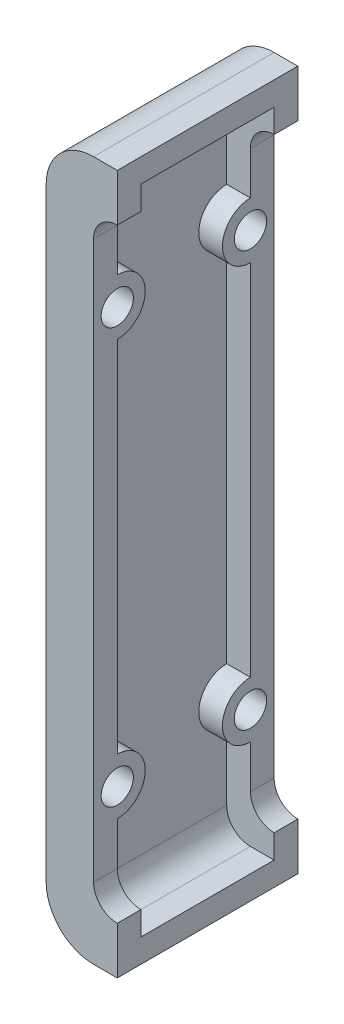
ISO-10303-21;
HEADER;
FILE_DESCRIPTION(('STEP AP214'),'2;1');
FILE_NAME('part.step','',(''),(''),'','','');
FILE_SCHEMA(('AUTOMOTIVE_DESIGN { 1 0 10303 214 1 1 1 1 }'));
ENDSEC;
DATA;
#1=APPLICATION_CONTEXT('core data for automotive mechanical design processes');
#2=APPLICATION_PROTOCOL_DEFINITION('international standard','automotive_design',2000,#1);
#3=PRODUCT_CONTEXT('',#1,'mechanical');
#4=PRODUCT('Part','Part','',(#3));
#5=PRODUCT_RELATED_PRODUCT_CATEGORY('part','',(#4));
#6=PRODUCT_DEFINITION_FORMATION('','',#4);
#7=PRODUCT_DEFINITION_CONTEXT('part definition',#1,'design');
#8=PRODUCT_DEFINITION('design','',#6,#7);
#9=PRODUCT_DEFINITION_SHAPE('','',#8);
#10=(LENGTH_UNIT() NAMED_UNIT(*) SI_UNIT(.MILLI.,.METRE.));
#11=(NAMED_UNIT(*) PLANE_ANGLE_UNIT() SI_UNIT($,.RADIAN.));
#12=(NAMED_UNIT(*) SI_UNIT($,.STERADIAN.) SOLID_ANGLE_UNIT());
#13=UNCERTAINTY_MEASURE_WITH_UNIT(LENGTH_MEASURE(1.E-05),#10,'distance_accuracy_value','');
#14=(GEOMETRIC_REPRESENTATION_CONTEXT(3) GLOBAL_UNCERTAINTY_ASSIGNED_CONTEXT((#13)) GLOBAL_UNIT_ASSIGNED_CONTEXT((#10,
#11,#12)) REPRESENTATION_CONTEXT('',''));
#15=CARTESIAN_POINT('',(0.,0.,0.));
#16=DIRECTION('',(0.,0.,1.));
#17=DIRECTION('',(1.,0.,0.));
#18=AXIS2_PLACEMENT_3D('',#15,#16,#17);
#19=CARTESIAN_POINT('',(-5.,-68.8,-14.05));
#20=DIRECTION('',(0.,0.,-1.));
#21=DIRECTION('',(-1.,0.,0.));
#22=AXIS2_PLACEMENT_3D('',#19,#20,#21);
#23=PLANE('',#22);
#24=DIRECTION('',(-1.,0.,0.));
#25=VECTOR('',#24,1.);
#26=CARTESIAN_POINT('',(13.1928010672488,37.9,-14.05));
#27=LINE('',#26,#25);
#28=CARTESIAN_POINT('',(0.,37.9,-14.05));
#29=VERTEX_POINT('',#28);
#30=CARTESIAN_POINT('',(-5.,37.9,-14.05));
#31=VERTEX_POINT('',#30);
#32=EDGE_CURVE('E581',#29,#31,#27,.T.);
#33=ORIENTED_EDGE('',*,*,#32,.T.);
#34=DIRECTION('',(0.,1.,0.));
#35=VECTOR('',#34,1.);
#36=CARTESIAN_POINT('',(-5.,-68.8,-14.05));
#37=LINE('',#36,#35);
#38=CARTESIAN_POINT('',(-5.,-37.9,-14.05));
#39=VERTEX_POINT('',#38);
#40=EDGE_CURVE('E267',#39,#31,#37,.T.);
#41=ORIENTED_EDGE('',*,*,#40,.F.);
#42=DIRECTION('',(-1.,0.,0.));
#43=VECTOR('',#42,1.);
#44=CARTESIAN_POINT('',(13.1928010672488,-37.9,-14.05));
#45=LINE('',#44,#43);
#46=CARTESIAN_POINT('',(0.,-37.9,-14.05));
#47=VERTEX_POINT('',#46);
#48=EDGE_CURVE('E470',#47,#39,#45,.T.);
#49=ORIENTED_EDGE('',*,*,#48,.F.);
#50=DIRECTION('',(0.,-1.,0.));
#51=VECTOR('',#50,1.);
#52=CARTESIAN_POINT('',(0.,63.8,-14.05));
#53=LINE('',#52,#51);
#54=EDGE_CURVE('E329',#29,#47,#53,.T.);
#55=ORIENTED_EDGE('',*,*,#54,.F.);
#56=EDGE_LOOP('',(#33,#41,#49,#55));
#57=FACE_BOUND('',#56,.T.);
#58=ADVANCED_FACE('F37',(#57),#23,.F.);
#59=CARTESIAN_POINT('',(-5.,0.,0.));
#60=DIRECTION('',(-1.,0.,0.));
#61=DIRECTION('',(0.,0.,1.));
#62=AXIS2_PLACEMENT_3D('',#59,#60,#61);
#63=PLANE('',#62);
#64=DIRECTION('',(0.,-1.,0.));
#65=VECTOR('',#64,1.);
#66=CARTESIAN_POINT('',(-5.,-68.8,14.05));
#67=LINE('',#66,#65);
#68=CARTESIAN_POINT('',(-5.,63.7999999999999,14.05));
#69=VERTEX_POINT('',#68);
#70=CARTESIAN_POINT('',(-5.,49.7,14.05));
#71=VERTEX_POINT('',#70);
#72=EDGE_CURVE('E235',#69,#71,#67,.T.);
#73=ORIENTED_EDGE('',*,*,#72,.T.);
#74=CARTESIAN_POINT('',(-5.,43.8,14.05));
#75=DIRECTION('',(-1.,0.,0.));
#76=DIRECTION('',(0.,0.,1.));
#77=AXIS2_PLACEMENT_3D('',#74,#75,#76);
#78=CIRCLE('',#77,5.9);
#79=CARTESIAN_POINT('',(-5.,37.9,14.05));
#80=VERTEX_POINT('',#79);
#81=EDGE_CURVE('E59',#71,#80,#78,.T.);
#82=ORIENTED_EDGE('',*,*,#81,.T.);
#83=CARTESIAN_POINT('',(-5.,-37.9,14.05));
#84=VERTEX_POINT('',#83);
#85=EDGE_CURVE('E269',#80,#84,#67,.T.);
#86=ORIENTED_EDGE('',*,*,#85,.T.);
#87=CARTESIAN_POINT('',(-5.,-43.8,14.05));
#88=DIRECTION('',(1.,0.,0.));
#89=DIRECTION('',(0.,0.,-1.));
#90=AXIS2_PLACEMENT_3D('',#87,#88,#89);
#91=CIRCLE('',#90,5.89999999999999);
#92=CARTESIAN_POINT('',(-5.,-49.7,14.05));
#93=VERTEX_POINT('',#92);
#94=EDGE_CURVE('E479',#84,#93,#91,.F.);
#95=ORIENTED_EDGE('',*,*,#94,.T.);
#96=CARTESIAN_POINT('',(-5.,-63.8,14.05));
#97=VERTEX_POINT('',#96);
#98=EDGE_CURVE('E266',#93,#97,#67,.T.);
#99=ORIENTED_EDGE('',*,*,#98,.T.);
#100=DIRECTION('',(0.,0.,-1.));
#101=VECTOR('',#100,1.);
#102=CARTESIAN_POINT('',(-5.,-63.8,-14.05));
#103=LINE('',#102,#101);
#104=CARTESIAN_POINT('',(-5.,-63.8,-14.05));
#105=VERTEX_POINT('',#104);
#106=EDGE_CURVE('E332',#97,#105,#103,.T.);
#107=ORIENTED_EDGE('',*,*,#106,.T.);
#108=CARTESIAN_POINT('',(-5.,-49.7,-14.05));
#109=VERTEX_POINT('',#108);
#110=EDGE_CURVE('E263',#105,#109,#37,.T.);
#111=ORIENTED_EDGE('',*,*,#110,.T.);
#112=CARTESIAN_POINT('',(-5.,-43.8,-14.05));
#113=DIRECTION('',(1.,0.,0.));
#114=DIRECTION('',(0.,0.,-1.));
#115=AXIS2_PLACEMENT_3D('',#112,#113,#114);
#116=CIRCLE('',#115,5.89999999999999);
#117=EDGE_CURVE('E471',#39,#109,#116,.T.);
#118=ORIENTED_EDGE('',*,*,#117,.F.);
#119=ORIENTED_EDGE('',*,*,#40,.T.);
#120=CARTESIAN_POINT('',(-5.,43.8,-14.05));
#121=DIRECTION('',(1.,0.,0.));
#122=DIRECTION('',(0.,0.,-1.));
#123=AXIS2_PLACEMENT_3D('',#120,#121,#122);
#124=CIRCLE('',#123,5.9);
#125=CARTESIAN_POINT('',(-5.,49.7,-14.05));
#126=VERTEX_POINT('',#125);
#127=EDGE_CURVE('E578',#126,#31,#124,.T.);
#128=ORIENTED_EDGE('',*,*,#127,.F.);
#129=CARTESIAN_POINT('',(-5.,63.7999999999999,-14.05));
#130=VERTEX_POINT('',#129);
#131=EDGE_CURVE('E262',#126,#130,#37,.T.);
#132=ORIENTED_EDGE('',*,*,#131,.T.);
#133=DIRECTION('',(0.,0.,1.));
#134=VECTOR('',#133,1.);
#135=CARTESIAN_POINT('',(-5.,63.8,14.05));
#136=LINE('',#135,#134);
#137=EDGE_CURVE('E328',#130,#69,#136,.T.);
#138=ORIENTED_EDGE('',*,*,#137,.T.);
#139=EDGE_LOOP('',(#73,#82,#86,#95,#99,#107,#111,#118,#119,#128,#132,#138));
#140=FACE_BOUND('',#139,.T.);
#141=ADVANCED_FACE('F443',(#140),#63,.F.);
#142=DIRECTION('',(-1.,0.,0.));
#143=VECTOR('',#142,1.);
#144=CARTESIAN_POINT('',(13.1928010672488,49.7,-14.05));
#145=LINE('',#144,#143);
#146=CARTESIAN_POINT('',(0.,49.7,-14.05));
#147=VERTEX_POINT('',#146);
#148=EDGE_CURVE('E587',#147,#126,#145,.T.);
#149=ORIENTED_EDGE('',*,*,#148,.F.);
#150=CARTESIAN_POINT('',(0.,58.8,-14.05));
#151=VERTEX_POINT('',#150);
#152=EDGE_CURVE('E325',#151,#147,#53,.T.);
#153=ORIENTED_EDGE('',*,*,#152,.F.);
#154=CARTESIAN_POINT('',(5.00000000000001,58.8,-14.05));
#155=DIRECTION('',(0.,0.,-1.));
#156=DIRECTION('',(-1.,0.,0.));
#157=AXIS2_PLACEMENT_3D('',#154,#155,#156);
#158=CIRCLE('',#157,5.);
#159=CARTESIAN_POINT('',(5.00000000000002,63.7999999999999,-14.05));
#160=VERTEX_POINT('',#159);
#161=EDGE_CURVE('E242',#151,#160,#158,.T.);
#162=ORIENTED_EDGE('',*,*,#161,.T.);
#163=DIRECTION('',(0.,1.,0.));
#164=VECTOR('',#163,1.);
#165=CARTESIAN_POINT('',(5.00000000000002,-68.8,-14.05));
#166=LINE('',#165,#164);
#167=CARTESIAN_POINT('',(5.00000000000002,68.8,-14.05));
#168=VERTEX_POINT('',#167);
#169=EDGE_CURVE('E238',#160,#168,#166,.T.);
#170=ORIENTED_EDGE('',*,*,#169,.T.);
#171=DIRECTION('',(1.,0.,0.));
#172=VECTOR('',#171,1.);
#173=CARTESIAN_POINT('',(-5.,68.8,-14.05));
#174=LINE('',#173,#172);
#175=CARTESIAN_POINT('',(0.,68.8,-14.05));
#176=VERTEX_POINT('',#175);
#177=EDGE_CURVE('E222',#176,#168,#174,.T.);
#178=ORIENTED_EDGE('',*,*,#177,.F.);
#179=CARTESIAN_POINT('',(0.,63.8,-14.05));
#180=DIRECTION('',(0.,0.,-1.));
#181=DIRECTION('',(-1.,0.,0.));
#182=AXIS2_PLACEMENT_3D('',#179,#180,#181);
#183=CIRCLE('',#182,5.);
#184=EDGE_CURVE('E335',#176,#130,#183,.F.);
#185=ORIENTED_EDGE('',*,*,#184,.T.);
#186=ORIENTED_EDGE('',*,*,#131,.F.);
#187=EDGE_LOOP('',(#149,#153,#162,#170,#178,#185,#186));
#188=FACE_BOUND('',#187,.T.);
#189=ADVANCED_FACE('F239',(#188),#23,.F.);
#190=DIRECTION('',(-1.,0.,0.));
#191=VECTOR('',#190,1.);
#192=CARTESIAN_POINT('',(13.1928010672488,-49.7,-14.05));
#193=LINE('',#192,#191);
#194=CARTESIAN_POINT('',(0.,-49.7,-14.05));
#195=VERTEX_POINT('',#194);
#196=EDGE_CURVE('E465',#195,#109,#193,.T.);
#197=ORIENTED_EDGE('',*,*,#196,.T.);
#198=ORIENTED_EDGE('',*,*,#110,.F.);
#199=CARTESIAN_POINT('',(0.,-63.8,-14.05));
#200=DIRECTION('',(0.,0.,-1.));
#201=DIRECTION('',(-1.,0.,0.));
#202=AXIS2_PLACEMENT_3D('',#199,#200,#201);
#203=CIRCLE('',#202,5.);
#204=CARTESIAN_POINT('',(0.,-68.8,-14.05));
#205=VERTEX_POINT('',#204);
#206=EDGE_CURVE('E337',#105,#205,#203,.F.);
#207=ORIENTED_EDGE('',*,*,#206,.T.);
#208=DIRECTION('',(1.,0.,0.));
#209=VECTOR('',#208,1.);
#210=CARTESIAN_POINT('',(-5.,-68.8,-14.05));
#211=LINE('',#210,#209);
#212=CARTESIAN_POINT('',(5.00000000000002,-68.8,-14.05));
#213=VERTEX_POINT('',#212);
#214=EDGE_CURVE('E270',#205,#213,#211,.T.);
#215=ORIENTED_EDGE('',*,*,#214,.T.);
#216=CARTESIAN_POINT('',(5.00000000000002,-63.8,-14.05));
#217=VERTEX_POINT('',#216);
#218=EDGE_CURVE('E246',#213,#217,#166,.T.);
#219=ORIENTED_EDGE('',*,*,#218,.T.);
#220=CARTESIAN_POINT('',(5.00000000000002,-58.8,-14.05));
#221=DIRECTION('',(0.,0.,-1.));
#222=DIRECTION('',(-1.,0.,0.));
#223=AXIS2_PLACEMENT_3D('',#220,#221,#222);
#224=CIRCLE('',#223,5.);
#225=CARTESIAN_POINT('',(0.,-58.8,-14.05));
#226=VERTEX_POINT('',#225);
#227=EDGE_CURVE('E359',#217,#226,#224,.T.);
#228=ORIENTED_EDGE('',*,*,#227,.T.);
#229=EDGE_CURVE('E323',#195,#226,#53,.T.);
#230=ORIENTED_EDGE('',*,*,#229,.F.);
#231=EDGE_LOOP('',(#197,#198,#207,#215,#219,#228,#230));
#232=FACE_BOUND('',#231,.T.);
#233=ADVANCED_FACE('F446',(#232),#23,.F.);
#234=CARTESIAN_POINT('',(-5.,-68.8,14.05));
#235=DIRECTION('',(0.,0.,1.));
#236=DIRECTION('',(1.,0.,0.));
#237=AXIS2_PLACEMENT_3D('',#234,#235,#236);
#238=PLANE('',#237);
#239=DIRECTION('',(0.,1.,0.));
#240=VECTOR('',#239,1.);
#241=CARTESIAN_POINT('',(0.,63.8,14.05));
#242=LINE('',#241,#240);
#243=CARTESIAN_POINT('',(0.,49.7,14.05));
#244=VERTEX_POINT('',#243);
#245=CARTESIAN_POINT('',(0.,58.8,14.05));
#246=VERTEX_POINT('',#245);
#247=EDGE_CURVE('E319',#244,#246,#242,.T.);
#248=ORIENTED_EDGE('',*,*,#247,.F.);
#249=DIRECTION('',(-1.,0.,0.));
#250=VECTOR('',#249,1.);
#251=CARTESIAN_POINT('',(13.1928010672488,49.7,14.05));
#252=LINE('',#251,#250);
#253=EDGE_CURVE('E52',#244,#71,#252,.T.);
#254=ORIENTED_EDGE('',*,*,#253,.T.);
#255=ORIENTED_EDGE('',*,*,#72,.F.);
#256=CARTESIAN_POINT('',(0.,63.8,14.05));
#257=DIRECTION('',(0.,0.,1.));
#258=DIRECTION('',(1.,0.,0.));
#259=AXIS2_PLACEMENT_3D('',#256,#257,#258);
#260=CIRCLE('',#259,5.);
#261=CARTESIAN_POINT('',(0.,68.8,14.05));
#262=VERTEX_POINT('',#261);
#263=EDGE_CURVE('E341',#69,#262,#260,.F.);
#264=ORIENTED_EDGE('',*,*,#263,.T.);
#265=DIRECTION('',(1.,0.,0.));
#266=VECTOR('',#265,1.);
#267=CARTESIAN_POINT('',(-5.,68.8,14.05));
#268=LINE('',#267,#266);
#269=CARTESIAN_POINT('',(5.00000000000002,68.8,14.05));
#270=VERTEX_POINT('',#269);
#271=EDGE_CURVE('E234',#262,#270,#268,.T.);
#272=ORIENTED_EDGE('',*,*,#271,.T.);
#273=DIRECTION('',(0.,-1.,0.));
#274=VECTOR('',#273,1.);
#275=CARTESIAN_POINT('',(5.00000000000002,-68.8,14.05));
#276=LINE('',#275,#274);
#277=CARTESIAN_POINT('',(5.00000000000002,63.7999999999999,14.05));
#278=VERTEX_POINT('',#277);
#279=EDGE_CURVE('E252',#270,#278,#276,.T.);
#280=ORIENTED_EDGE('',*,*,#279,.T.);
#281=CARTESIAN_POINT('',(5.00000000000001,58.8,14.05));
#282=DIRECTION('',(0.,0.,1.));
#283=DIRECTION('',(1.,0.,0.));
#284=AXIS2_PLACEMENT_3D('',#281,#282,#283);
#285=CIRCLE('',#284,5.);
#286=EDGE_CURVE('E369',#278,#246,#285,.T.);
#287=ORIENTED_EDGE('',*,*,#286,.T.);
#288=EDGE_LOOP('',(#248,#254,#255,#264,#272,#280,#287));
#289=FACE_BOUND('',#288,.T.);
#290=ADVANCED_FACE('F455',(#289),#238,.F.);
#291=ORIENTED_EDGE('',*,*,#85,.F.);
#292=DIRECTION('',(-1.,0.,0.));
#293=VECTOR('',#292,1.);
#294=CARTESIAN_POINT('',(13.1928010672488,37.9,14.05));
#295=LINE('',#294,#293);
#296=CARTESIAN_POINT('',(0.,37.9,14.05));
#297=VERTEX_POINT('',#296);
#298=EDGE_CURVE('E594',#297,#80,#295,.T.);
#299=ORIENTED_EDGE('',*,*,#298,.F.);
#300=CARTESIAN_POINT('',(0.,-37.9,14.05));
#301=VERTEX_POINT('',#300);
#302=EDGE_CURVE('E324',#301,#297,#242,.T.);
#303=ORIENTED_EDGE('',*,*,#302,.F.);
#304=DIRECTION('',(-1.,0.,0.));
#305=VECTOR('',#304,1.);
#306=CARTESIAN_POINT('',(13.1928010672488,-37.9,14.05));
#307=LINE('',#306,#305);
#308=EDGE_CURVE('E577',#301,#84,#307,.T.);
#309=ORIENTED_EDGE('',*,*,#308,.T.);
#310=EDGE_LOOP('',(#291,#299,#303,#309));
#311=FACE_BOUND('',#310,.T.);
#312=ADVANCED_FACE('F460',(#311),#238,.F.);
#313=CARTESIAN_POINT('',(0.,63.8,19.05));
#314=DIRECTION('',(-1.,0.,0.));
#315=DIRECTION('',(0.,0.,1.));
#316=AXIS2_PLACEMENT_3D('',#313,#314,#315);
#317=PLANE('',#316);
#318=CARTESIAN_POINT('',(0.,43.8,-14.05));
#319=DIRECTION('',(-1.,0.,0.));
#320=DIRECTION('',(0.,0.,1.));
#321=AXIS2_PLACEMENT_3D('',#318,#319,#320);
#322=CIRCLE('',#321,5.9);
#323=EDGE_CURVE('E585',#29,#147,#322,.T.);
#324=ORIENTED_EDGE('',*,*,#323,.F.);
#325=ORIENTED_EDGE('',*,*,#54,.T.);
#326=CARTESIAN_POINT('',(0.,-43.8,-14.05));
#327=DIRECTION('',(-1.,0.,0.));
#328=DIRECTION('',(0.,0.,1.));
#329=AXIS2_PLACEMENT_3D('',#326,#327,#328);
#330=CIRCLE('',#329,5.89999999999999);
#331=EDGE_CURVE('E484',#195,#47,#330,.T.);
#332=ORIENTED_EDGE('',*,*,#331,.F.);
#333=ORIENTED_EDGE('',*,*,#229,.T.);
#334=DIRECTION('',(0.,0.,-1.));
#335=VECTOR('',#334,1.);
#336=CARTESIAN_POINT('',(0.,-58.8,-19.05));
#337=LINE('',#336,#335);
#338=CARTESIAN_POINT('',(0.,-58.8,-19.05));
#339=VERTEX_POINT('',#338);
#340=EDGE_CURVE('E348',#226,#339,#337,.T.);
#341=ORIENTED_EDGE('',*,*,#340,.T.);
#342=DIRECTION('',(0.,1.,0.));
#343=VECTOR('',#342,1.);
#344=CARTESIAN_POINT('',(0.,63.8,-19.05));
#345=LINE('',#344,#343);
#346=CARTESIAN_POINT('',(0.,58.8,-19.05));
#347=VERTEX_POINT('',#346);
#348=EDGE_CURVE('E279',#339,#347,#345,.T.);
#349=ORIENTED_EDGE('',*,*,#348,.T.);
#350=DIRECTION('',(0.,0.,-1.));
#351=VECTOR('',#350,1.);
#352=CARTESIAN_POINT('',(0.,58.8,-14.05));
#353=LINE('',#352,#351);
#354=EDGE_CURVE('E346',#347,#151,#353,.F.);
#355=ORIENTED_EDGE('',*,*,#354,.T.);
#356=ORIENTED_EDGE('',*,*,#152,.T.);
#357=EDGE_LOOP('',(#324,#325,#332,#333,#341,#349,#355,#356));
#358=FACE_BOUND('',#357,.T.);
#359=CARTESIAN_POINT('',(0.,43.8,-14.05));
#360=DIRECTION('',(-1.,0.,0.));
#361=DIRECTION('',(0.,0.,1.));
#362=AXIS2_PLACEMENT_3D('',#359,#360,#361);
#363=CIRCLE('',#362,3.39999999999999);
#364=CARTESIAN_POINT('',(0.,43.8,-10.65));
#365=VERTEX_POINT('',#364);
#366=EDGE_CURVE('E491',#365,#365,#363,.T.);
#367=ORIENTED_EDGE('',*,*,#366,.T.);
#368=EDGE_LOOP('',(#367));
#369=FACE_BOUND('',#368,.T.);
#370=CARTESIAN_POINT('',(0.,-43.8,-14.05));
#371=DIRECTION('',(-1.,0.,0.));
#372=DIRECTION('',(0.,0.,1.));
#373=AXIS2_PLACEMENT_3D('',#370,#371,#372);
#374=CIRCLE('',#373,3.39999999999999);
#375=CARTESIAN_POINT('',(0.,-43.8,-10.65));
#376=VERTEX_POINT('',#375);
#377=EDGE_CURVE('E503',#376,#376,#374,.T.);
#378=ORIENTED_EDGE('',*,*,#377,.T.);
#379=EDGE_LOOP('',(#378));
#380=FACE_BOUND('',#379,.T.);
#381=ADVANCED_FACE('F424',(#358,#369,#380),#317,.F.);
#382=CARTESIAN_POINT('',(5.00000000000002,63.8,19.05));
#383=DIRECTION('',(-1.,0.,0.));
#384=DIRECTION('',(0.,-1.,0.));
#385=AXIS2_PLACEMENT_3D('',#382,#383,#384);
#386=PLANE('',#385);
#387=DIRECTION('',(0.,0.,1.));
#388=VECTOR('',#387,1.);
#389=CARTESIAN_POINT('',(5.00000000000002,68.8,14.05));
#390=LINE('',#389,#388);
#391=EDGE_CURVE('E227',#168,#270,#390,.T.);
#392=ORIENTED_EDGE('',*,*,#391,.F.);
#393=ORIENTED_EDGE('',*,*,#169,.F.);
#394=DIRECTION('',(0.,0.,-1.));
#395=VECTOR('',#394,1.);
#396=CARTESIAN_POINT('',(5.00000000000002,63.8,19.05));
#397=LINE('',#396,#395);
#398=CARTESIAN_POINT('',(5.00000000000002,63.8,-19.05));
#399=VERTEX_POINT('',#398);
#400=EDGE_CURVE('E316',#160,#399,#397,.T.);
#401=ORIENTED_EDGE('',*,*,#400,.T.);
#402=DIRECTION('',(0.,1.,0.));
#403=VECTOR('',#402,1.);
#404=CARTESIAN_POINT('',(5.00000000000002,63.8,-19.05));
#405=LINE('',#404,#403);
#406=CARTESIAN_POINT('',(5.00000000000002,73.8,-19.05));
#407=VERTEX_POINT('',#406);
#408=EDGE_CURVE('E272',#399,#407,#405,.T.);
#409=ORIENTED_EDGE('',*,*,#408,.T.);
#410=DIRECTION('',(0.,0.,-1.));
#411=VECTOR('',#410,1.);
#412=CARTESIAN_POINT('',(5.00000000000002,73.8,19.05));
#413=LINE('',#412,#411);
#414=CARTESIAN_POINT('',(5.00000000000002,73.8,19.05));
#415=VERTEX_POINT('',#414);
#416=EDGE_CURVE('E313',#415,#407,#413,.T.);
#417=ORIENTED_EDGE('',*,*,#416,.F.);
#418=DIRECTION('',(0.,1.,0.));
#419=VECTOR('',#418,1.);
#420=CARTESIAN_POINT('',(5.00000000000002,63.8,19.05));
#421=LINE('',#420,#419);
#422=CARTESIAN_POINT('',(5.00000000000002,63.8,19.05));
#423=VERTEX_POINT('',#422);
#424=EDGE_CURVE('E276',#423,#415,#421,.T.);
#425=ORIENTED_EDGE('',*,*,#424,.F.);
#426=EDGE_CURVE('E317',#423,#278,#397,.T.);
#427=ORIENTED_EDGE('',*,*,#426,.T.);
#428=ORIENTED_EDGE('',*,*,#279,.F.);
#429=EDGE_LOOP('',(#392,#393,#401,#409,#417,#425,#427,#428));
#430=FACE_BOUND('',#429,.T.);
#431=ADVANCED_FACE('F249',(#430),#386,.F.);
#432=CARTESIAN_POINT('',(5.00000000000002,73.8,19.05));
#433=DIRECTION('',(0.,-1.,0.));
#434=DIRECTION('',(0.,0.,-1.));
#435=AXIS2_PLACEMENT_3D('',#432,#433,#434);
#436=PLANE('',#435);
#437=DIRECTION('',(-1.,0.,0.));
#438=VECTOR('',#437,1.);
#439=CARTESIAN_POINT('',(5.00000000000002,73.8,-19.05));
#440=LINE('',#439,#438);
#441=CARTESIAN_POINT('',(0.,73.8,-19.05));
#442=VERTEX_POINT('',#441);
#443=EDGE_CURVE('E294',#407,#442,#440,.T.);
#444=ORIENTED_EDGE('',*,*,#443,.T.);
#445=DIRECTION('',(0.,0.,-1.));
#446=VECTOR('',#445,1.);
#447=CARTESIAN_POINT('',(0.,73.8,19.05));
#448=LINE('',#447,#446);
#449=CARTESIAN_POINT('',(0.,73.8,19.05));
#450=VERTEX_POINT('',#449);
#451=EDGE_CURVE('E11',#442,#450,#448,.F.);
#452=ORIENTED_EDGE('',*,*,#451,.T.);
#453=DIRECTION('',(-1.,0.,0.));
#454=VECTOR('',#453,1.);
#455=CARTESIAN_POINT('',(5.00000000000002,73.8,19.05));
#456=LINE('',#455,#454);
#457=EDGE_CURVE('E278',#415,#450,#456,.T.);
#458=ORIENTED_EDGE('',*,*,#457,.F.);
#459=ORIENTED_EDGE('',*,*,#416,.T.);
#460=EDGE_LOOP('',(#444,#452,#458,#459));
#461=FACE_BOUND('',#460,.T.);
#462=ADVANCED_FACE('F414',(#461),#436,.F.);
#463=CARTESIAN_POINT('',(-9.99999999999998,73.8,19.05));
#464=DIRECTION('',(1.,0.,0.));
#465=DIRECTION('',(0.,0.,-1.));
#466=AXIS2_PLACEMENT_3D('',#463,#464,#465);
#467=PLANE('',#466);
#468=CARTESIAN_POINT('',(-9.99999999999998,43.8,-14.05));
#469=DIRECTION('',(-1.,0.,0.));
#470=DIRECTION('',(0.,0.,1.));
#471=AXIS2_PLACEMENT_3D('',#468,#469,#470);
#472=CIRCLE('',#471,3.39999999999999);
#473=CARTESIAN_POINT('',(-9.99999999999998,43.8,-10.65));
#474=VERTEX_POINT('',#473);
#475=EDGE_CURVE('E488',#474,#474,#472,.T.);
#476=ORIENTED_EDGE('',*,*,#475,.F.);
#477=EDGE_LOOP('',(#476));
#478=FACE_BOUND('',#477,.T.);
#479=CARTESIAN_POINT('',(-9.99999999999998,43.8,14.05));
#480=DIRECTION('',(-1.,0.,0.));
#481=DIRECTION('',(0.,0.,1.));
#482=AXIS2_PLACEMENT_3D('',#479,#480,#481);
#483=CIRCLE('',#482,3.39999999999999);
#484=CARTESIAN_POINT('',(-9.99999999999998,43.8,17.45));
#485=VERTEX_POINT('',#484);
#486=EDGE_CURVE('E494',#485,#485,#483,.T.);
#487=ORIENTED_EDGE('',*,*,#486,.F.);
#488=EDGE_LOOP('',(#487));
#489=FACE_BOUND('',#488,.T.);
#490=CARTESIAN_POINT('',(-9.99999999999998,-43.8,-14.05));
#491=DIRECTION('',(-1.,0.,0.));
#492=DIRECTION('',(0.,0.,1.));
#493=AXIS2_PLACEMENT_3D('',#490,#491,#492);
#494=CIRCLE('',#493,3.39999999999999);
#495=CARTESIAN_POINT('',(-9.99999999999998,-43.8,-10.65));
#496=VERTEX_POINT('',#495);
#497=EDGE_CURVE('E500',#496,#496,#494,.T.);
#498=ORIENTED_EDGE('',*,*,#497,.F.);
#499=EDGE_LOOP('',(#498));
#500=FACE_BOUND('',#499,.T.);
#501=CARTESIAN_POINT('',(-9.99999999999998,-43.8,14.05));
#502=DIRECTION('',(-1.,0.,0.));
#503=DIRECTION('',(0.,0.,1.));
#504=AXIS2_PLACEMENT_3D('',#501,#502,#503);
#505=CIRCLE('',#504,3.39999999999999);
#506=CARTESIAN_POINT('',(-9.99999999999998,-43.8,17.45));
#507=VERTEX_POINT('',#506);
#508=EDGE_CURVE('E506',#507,#507,#505,.T.);
#509=ORIENTED_EDGE('',*,*,#508,.F.);
#510=EDGE_LOOP('',(#509));
#511=FACE_BOUND('',#510,.T.);
#512=DIRECTION('',(0.,-1.,0.));
#513=VECTOR('',#512,1.);
#514=CARTESIAN_POINT('',(-9.99999999999998,73.8,-19.05));
#515=LINE('',#514,#513);
#516=CARTESIAN_POINT('',(-9.99999999999998,63.8,-19.05));
#517=VERTEX_POINT('',#516);
#518=CARTESIAN_POINT('',(-9.99999999999998,-63.8,-19.05));
#519=VERTEX_POINT('',#518);
#520=EDGE_CURVE('E297',#517,#519,#515,.T.);
#521=ORIENTED_EDGE('',*,*,#520,.T.);
#522=DIRECTION('',(0.,0.,-1.));
#523=VECTOR('',#522,1.);
#524=CARTESIAN_POINT('',(-9.99999999999998,-63.8,19.05));
#525=LINE('',#524,#523);
#526=CARTESIAN_POINT('',(-9.99999999999998,-63.8,19.05));
#527=VERTEX_POINT('',#526);
#528=EDGE_CURVE('E384',#519,#527,#525,.F.);
#529=ORIENTED_EDGE('',*,*,#528,.T.);
#530=DIRECTION('',(0.,-1.,0.));
#531=VECTOR('',#530,1.);
#532=CARTESIAN_POINT('',(-9.99999999999998,73.8,19.05));
#533=LINE('',#532,#531);
#534=CARTESIAN_POINT('',(-9.99999999999998,63.8,19.05));
#535=VERTEX_POINT('',#534);
#536=EDGE_CURVE('E282',#535,#527,#533,.T.);
#537=ORIENTED_EDGE('',*,*,#536,.F.);
#538=DIRECTION('',(0.,0.,-1.));
#539=VECTOR('',#538,1.);
#540=CARTESIAN_POINT('',(-9.99999999999998,63.8,19.05));
#541=LINE('',#540,#539);
#542=EDGE_CURVE('E381',#535,#517,#541,.T.);
#543=ORIENTED_EDGE('',*,*,#542,.T.);
#544=EDGE_LOOP('',(#521,#529,#537,#543));
#545=FACE_BOUND('',#544,.T.);
#546=ADVANCED_FACE('F406',(#478,#489,#500,#511,#545),#467,.F.);
#547=CARTESIAN_POINT('',(-9.99999999999998,-73.8,19.05));
#548=DIRECTION('',(0.,1.,0.));
#549=DIRECTION('',(0.,0.,1.));
#550=AXIS2_PLACEMENT_3D('',#547,#548,#549);
#551=PLANE('',#550);
#552=DIRECTION('',(1.,0.,0.));
#553=VECTOR('',#552,1.);
#554=CARTESIAN_POINT('',(-9.99999999999998,-73.8,19.05));
#555=LINE('',#554,#553);
#556=CARTESIAN_POINT('',(0.,-73.8,19.05));
#557=VERTEX_POINT('',#556);
#558=CARTESIAN_POINT('',(5.00000000000002,-73.8,19.05));
#559=VERTEX_POINT('',#558);
#560=EDGE_CURVE('E285',#557,#559,#555,.T.);
#561=ORIENTED_EDGE('',*,*,#560,.F.);
#562=DIRECTION('',(0.,0.,-1.));
#563=VECTOR('',#562,1.);
#564=CARTESIAN_POINT('',(0.,-73.8,19.05));
#565=LINE('',#564,#563);
#566=CARTESIAN_POINT('',(0.,-73.8,-19.05));
#567=VERTEX_POINT('',#566);
#568=EDGE_CURVE('E374',#557,#567,#565,.T.);
#569=ORIENTED_EDGE('',*,*,#568,.T.);
#570=DIRECTION('',(1.,0.,0.));
#571=VECTOR('',#570,1.);
#572=CARTESIAN_POINT('',(-9.99999999999998,-73.8,-19.05));
#573=LINE('',#572,#571);
#574=CARTESIAN_POINT('',(5.00000000000002,-73.8,-19.05));
#575=VERTEX_POINT('',#574);
#576=EDGE_CURVE('E300',#567,#575,#573,.T.);
#577=ORIENTED_EDGE('',*,*,#576,.T.);
#578=DIRECTION('',(0.,0.,-1.));
#579=VECTOR('',#578,1.);
#580=CARTESIAN_POINT('',(5.00000000000002,-73.8,19.05));
#581=LINE('',#580,#579);
#582=EDGE_CURVE('E310',#559,#575,#581,.T.);
#583=ORIENTED_EDGE('',*,*,#582,.F.);
#584=EDGE_LOOP('',(#561,#569,#577,#583));
#585=FACE_BOUND('',#584,.T.);
#586=ADVANCED_FACE('F397',(#585),#551,.F.);
#587=CARTESIAN_POINT('',(5.00000000000002,-73.8,19.05));
#588=DIRECTION('',(-1.,0.,0.));
#589=DIRECTION('',(0.,-1.,0.));
#590=AXIS2_PLACEMENT_3D('',#587,#588,#589);
#591=PLANE('',#590);
#592=DIRECTION('',(0.,0.,-1.));
#593=VECTOR('',#592,1.);
#594=CARTESIAN_POINT('',(5.00000000000002,-63.8,19.05));
#595=LINE('',#594,#593);
#596=CARTESIAN_POINT('',(5.00000000000002,-63.8,-19.05));
#597=VERTEX_POINT('',#596);
#598=EDGE_CURVE('E292',#217,#597,#595,.T.);
#599=ORIENTED_EDGE('',*,*,#598,.F.);
#600=ORIENTED_EDGE('',*,*,#218,.F.);
#601=DIRECTION('',(0.,0.,-1.));
#602=VECTOR('',#601,1.);
#603=CARTESIAN_POINT('',(5.00000000000002,-68.8,14.05));
#604=LINE('',#603,#602);
#605=CARTESIAN_POINT('',(5.00000000000002,-68.8,14.05));
#606=VERTEX_POINT('',#605);
#607=EDGE_CURVE('E259',#606,#213,#604,.T.);
#608=ORIENTED_EDGE('',*,*,#607,.F.);
#609=CARTESIAN_POINT('',(5.00000000000002,-63.8,14.05));
#610=VERTEX_POINT('',#609);
#611=EDGE_CURVE('E253',#610,#606,#276,.T.);
#612=ORIENTED_EDGE('',*,*,#611,.F.);
#613=CARTESIAN_POINT('',(5.00000000000002,-63.8,19.05));
#614=VERTEX_POINT('',#613);
#615=EDGE_CURVE('E307',#614,#610,#595,.T.);
#616=ORIENTED_EDGE('',*,*,#615,.F.);
#617=DIRECTION('',(0.,1.,0.));
#618=VECTOR('',#617,1.);
#619=CARTESIAN_POINT('',(5.00000000000002,-73.8,19.05));
#620=LINE('',#619,#618);
#621=EDGE_CURVE('E287',#559,#614,#620,.T.);
#622=ORIENTED_EDGE('',*,*,#621,.F.);
#623=ORIENTED_EDGE('',*,*,#582,.T.);
#624=DIRECTION('',(0.,1.,0.));
#625=VECTOR('',#624,1.);
#626=CARTESIAN_POINT('',(5.00000000000002,-73.8,-19.05));
#627=LINE('',#626,#625);
#628=EDGE_CURVE('E302',#575,#597,#627,.T.);
#629=ORIENTED_EDGE('',*,*,#628,.T.);
#630=EDGE_LOOP('',(#599,#600,#608,#612,#616,#622,#623,#629));
#631=FACE_BOUND('',#630,.T.);
#632=ADVANCED_FACE('F527',(#631),#591,.F.);
#633=CARTESIAN_POINT('',(0.,43.8,14.05));
#634=DIRECTION('',(-1.,0.,0.));
#635=DIRECTION('',(0.,0.,1.));
#636=AXIS2_PLACEMENT_3D('',#633,#634,#635);
#637=CIRCLE('',#636,5.9);
#638=EDGE_CURVE('E597',#297,#244,#637,.F.);
#639=ORIENTED_EDGE('',*,*,#638,.T.);
#640=ORIENTED_EDGE('',*,*,#247,.T.);
#641=DIRECTION('',(0.,0.,-1.));
#642=VECTOR('',#641,1.);
#643=CARTESIAN_POINT('',(0.,58.8,19.05));
#644=LINE('',#643,#642);
#645=CARTESIAN_POINT('',(0.,58.8,19.05));
#646=VERTEX_POINT('',#645);
#647=EDGE_CURVE('E352',#246,#646,#644,.F.);
#648=ORIENTED_EDGE('',*,*,#647,.T.);
#649=DIRECTION('',(0.,1.,0.));
#650=VECTOR('',#649,1.);
#651=CARTESIAN_POINT('',(0.,63.8,19.05));
#652=LINE('',#651,#650);
#653=CARTESIAN_POINT('',(0.,-58.8,19.05));
#654=VERTEX_POINT('',#653);
#655=EDGE_CURVE('E289',#654,#646,#652,.T.);
#656=ORIENTED_EDGE('',*,*,#655,.F.);
#657=DIRECTION('',(0.,0.,-1.));
#658=VECTOR('',#657,1.);
#659=CARTESIAN_POINT('',(0.,-58.8,14.05));
#660=LINE('',#659,#658);
#661=CARTESIAN_POINT('',(0.,-58.8,14.05));
#662=VERTEX_POINT('',#661);
#663=EDGE_CURVE('E354',#654,#662,#660,.T.);
#664=ORIENTED_EDGE('',*,*,#663,.T.);
#665=CARTESIAN_POINT('',(0.,-49.7,14.05));
#666=VERTEX_POINT('',#665);
#667=EDGE_CURVE('E320',#662,#666,#242,.T.);
#668=ORIENTED_EDGE('',*,*,#667,.T.);
#669=CARTESIAN_POINT('',(0.,-43.8,14.05));
#670=DIRECTION('',(-1.,0.,0.));
#671=DIRECTION('',(0.,0.,1.));
#672=AXIS2_PLACEMENT_3D('',#669,#670,#671);
#673=CIRCLE('',#672,5.89999999999999);
#674=EDGE_CURVE('E571',#666,#301,#673,.F.);
#675=ORIENTED_EDGE('',*,*,#674,.T.);
#676=ORIENTED_EDGE('',*,*,#302,.T.);
#677=EDGE_LOOP('',(#639,#640,#648,#656,#664,#668,#675,#676));
#678=FACE_BOUND('',#677,.T.);
#679=CARTESIAN_POINT('',(0.,43.8,14.05));
#680=DIRECTION('',(-1.,0.,0.));
#681=DIRECTION('',(0.,0.,1.));
#682=AXIS2_PLACEMENT_3D('',#679,#680,#681);
#683=CIRCLE('',#682,3.39999999999999);
#684=CARTESIAN_POINT('',(0.,43.8,17.45));
#685=VERTEX_POINT('',#684);
#686=EDGE_CURVE('E497',#685,#685,#683,.T.);
#687=ORIENTED_EDGE('',*,*,#686,.T.);
#688=EDGE_LOOP('',(#687));
#689=FACE_BOUND('',#688,.T.);
#690=CARTESIAN_POINT('',(0.,-43.8,14.05));
#691=DIRECTION('',(-1.,0.,0.));
#692=DIRECTION('',(0.,0.,1.));
#693=AXIS2_PLACEMENT_3D('',#690,#691,#692);
#694=CIRCLE('',#693,3.39999999999999);
#695=CARTESIAN_POINT('',(0.,-43.8,17.45));
#696=VERTEX_POINT('',#695);
#697=EDGE_CURVE('E247',#696,#696,#694,.T.);
#698=ORIENTED_EDGE('',*,*,#697,.T.);
#699=EDGE_LOOP('',(#698));
#700=FACE_BOUND('',#699,.T.);
#701=ADVANCED_FACE('F511',(#678,#689,#700),#317,.F.);
#702=CARTESIAN_POINT('',(0.,0.,19.05));
#703=DIRECTION('',(0.,0.,1.));
#704=DIRECTION('',(1.,0.,0.));
#705=AXIS2_PLACEMENT_3D('',#702,#703,#704);
#706=PLANE('',#705);
#707=ORIENTED_EDGE('',*,*,#536,.T.);
#708=CARTESIAN_POINT('',(0.,-63.8,19.05));
#709=DIRECTION('',(0.,0.,1.));
#710=DIRECTION('',(1.,0.,0.));
#711=AXIS2_PLACEMENT_3D('',#708,#709,#710);
#712=CIRCLE('',#711,10.);
#713=EDGE_CURVE('E45',#527,#557,#712,.T.);
#714=ORIENTED_EDGE('',*,*,#713,.T.);
#715=ORIENTED_EDGE('',*,*,#560,.T.);
#716=ORIENTED_EDGE('',*,*,#621,.T.);
#717=CARTESIAN_POINT('',(5.00000000000002,-58.8,19.05));
#718=DIRECTION('',(0.,0.,1.));
#719=DIRECTION('',(1.,0.,0.));
#720=AXIS2_PLACEMENT_3D('',#717,#718,#719);
#721=CIRCLE('',#720,5.);
#722=EDGE_CURVE('E367',#614,#654,#721,.F.);
#723=ORIENTED_EDGE('',*,*,#722,.T.);
#724=ORIENTED_EDGE('',*,*,#655,.T.);
#725=CARTESIAN_POINT('',(5.00000000000001,58.8,19.05));
#726=DIRECTION('',(0.,0.,1.));
#727=DIRECTION('',(1.,0.,0.));
#728=AXIS2_PLACEMENT_3D('',#725,#726,#727);
#729=CIRCLE('',#728,5.);
#730=EDGE_CURVE('E372',#646,#423,#729,.F.);
#731=ORIENTED_EDGE('',*,*,#730,.T.);
#732=ORIENTED_EDGE('',*,*,#424,.T.);
#733=ORIENTED_EDGE('',*,*,#457,.T.);
#734=CARTESIAN_POINT('',(0.,63.8,19.05));
#735=DIRECTION('',(0.,0.,1.));
#736=DIRECTION('',(1.,0.,0.));
#737=AXIS2_PLACEMENT_3D('',#734,#735,#736);
#738=CIRCLE('',#737,10.);
#739=EDGE_CURVE('E386',#450,#535,#738,.T.);
#740=ORIENTED_EDGE('',*,*,#739,.T.);
#741=EDGE_LOOP('',(#707,#714,#715,#716,#723,#724,#731,#732,#733,#740));
#742=FACE_BOUND('',#741,.T.);
#743=ADVANCED_FACE('F390',(#742),#706,.T.);
#744=CARTESIAN_POINT('',(0.,0.,-19.05));
#745=DIRECTION('',(0.,0.,1.));
#746=DIRECTION('',(1.,0.,0.));
#747=AXIS2_PLACEMENT_3D('',#744,#745,#746);
#748=PLANE('',#747);
#749=ORIENTED_EDGE('',*,*,#576,.F.);
#750=CARTESIAN_POINT('',(0.,-63.8,-19.05));
#751=DIRECTION('',(0.,0.,1.));
#752=DIRECTION('',(1.,0.,0.));
#753=AXIS2_PLACEMENT_3D('',#750,#751,#752);
#754=CIRCLE('',#753,10.);
#755=EDGE_CURVE('E379',#567,#519,#754,.F.);
#756=ORIENTED_EDGE('',*,*,#755,.T.);
#757=ORIENTED_EDGE('',*,*,#520,.F.);
#758=CARTESIAN_POINT('',(0.,63.8,-19.05));
#759=DIRECTION('',(0.,0.,1.));
#760=DIRECTION('',(1.,0.,0.));
#761=AXIS2_PLACEMENT_3D('',#758,#759,#760);
#762=CIRCLE('',#761,10.);
#763=EDGE_CURVE('E377',#517,#442,#762,.F.);
#764=ORIENTED_EDGE('',*,*,#763,.T.);
#765=ORIENTED_EDGE('',*,*,#443,.F.);
#766=ORIENTED_EDGE('',*,*,#408,.F.);
#767=CARTESIAN_POINT('',(5.00000000000001,58.8,-19.05));
#768=DIRECTION('',(0.,0.,1.));
#769=DIRECTION('',(1.,0.,0.));
#770=AXIS2_PLACEMENT_3D('',#767,#768,#769);
#771=CIRCLE('',#770,5.);
#772=EDGE_CURVE('E362',#399,#347,#771,.T.);
#773=ORIENTED_EDGE('',*,*,#772,.T.);
#774=ORIENTED_EDGE('',*,*,#348,.F.);
#775=CARTESIAN_POINT('',(5.00000000000002,-58.8,-19.05));
#776=DIRECTION('',(0.,0.,1.));
#777=DIRECTION('',(1.,0.,0.));
#778=AXIS2_PLACEMENT_3D('',#775,#776,#777);
#779=CIRCLE('',#778,5.);
#780=EDGE_CURVE('E357',#339,#597,#779,.T.);
#781=ORIENTED_EDGE('',*,*,#780,.T.);
#782=ORIENTED_EDGE('',*,*,#628,.F.);
#783=EDGE_LOOP('',(#749,#756,#757,#764,#765,#766,#773,#774,#781,#782));
#784=FACE_BOUND('',#783,.T.);
#785=ADVANCED_FACE('F403',(#784),#748,.F.);
#786=ORIENTED_EDGE('',*,*,#98,.F.);
#787=DIRECTION('',(-1.,0.,0.));
#788=VECTOR('',#787,1.);
#789=CARTESIAN_POINT('',(13.1928010672488,-49.7,14.05));
#790=LINE('',#789,#788);
#791=EDGE_CURVE('E481',#666,#93,#790,.T.);
#792=ORIENTED_EDGE('',*,*,#791,.F.);
#793=ORIENTED_EDGE('',*,*,#667,.F.);
#794=CARTESIAN_POINT('',(5.00000000000002,-58.8,14.05));
#795=DIRECTION('',(0.,0.,1.));
#796=DIRECTION('',(1.,0.,0.));
#797=AXIS2_PLACEMENT_3D('',#794,#795,#796);
#798=CIRCLE('',#797,5.);
#799=EDGE_CURVE('E365',#662,#610,#798,.T.);
#800=ORIENTED_EDGE('',*,*,#799,.T.);
#801=ORIENTED_EDGE('',*,*,#611,.T.);
#802=DIRECTION('',(1.,0.,0.));
#803=VECTOR('',#802,1.);
#804=CARTESIAN_POINT('',(-5.,-68.8,14.05));
#805=LINE('',#804,#803);
#806=CARTESIAN_POINT('',(0.,-68.8,14.05));
#807=VERTEX_POINT('',#806);
#808=EDGE_CURVE('E273',#807,#606,#805,.T.);
#809=ORIENTED_EDGE('',*,*,#808,.F.);
#810=CARTESIAN_POINT('',(0.,-63.8,14.05));
#811=DIRECTION('',(0.,0.,1.));
#812=DIRECTION('',(1.,0.,0.));
#813=AXIS2_PLACEMENT_3D('',#810,#811,#812);
#814=CIRCLE('',#813,5.);
#815=EDGE_CURVE('E343',#807,#97,#814,.F.);
#816=ORIENTED_EDGE('',*,*,#815,.T.);
#817=EDGE_LOOP('',(#786,#792,#793,#800,#801,#809,#816));
#818=FACE_BOUND('',#817,.T.);
#819=ADVANCED_FACE('F462',(#818),#238,.F.);
#820=CARTESIAN_POINT('',(-5.,-68.8,14.05));
#821=DIRECTION('',(0.,-1.,0.));
#822=DIRECTION('',(0.,0.,-1.));
#823=AXIS2_PLACEMENT_3D('',#820,#821,#822);
#824=PLANE('',#823);
#825=ORIENTED_EDGE('',*,*,#214,.F.);
#826=DIRECTION('',(0.,0.,-1.));
#827=VECTOR('',#826,1.);
#828=CARTESIAN_POINT('',(0.,-68.8,14.05));
#829=LINE('',#828,#827);
#830=EDGE_CURVE('E339',#205,#807,#829,.F.);
#831=ORIENTED_EDGE('',*,*,#830,.T.);
#832=ORIENTED_EDGE('',*,*,#808,.T.);
#833=ORIENTED_EDGE('',*,*,#607,.T.);
#834=EDGE_LOOP('',(#825,#831,#832,#833));
#835=FACE_BOUND('',#834,.T.);
#836=ADVANCED_FACE('F541',(#835),#824,.F.);
#837=CARTESIAN_POINT('',(-5.,68.8,14.05));
#838=DIRECTION('',(0.,1.,0.));
#839=DIRECTION('',(0.,0.,1.));
#840=AXIS2_PLACEMENT_3D('',#837,#838,#839);
#841=PLANE('',#840);
#842=ORIENTED_EDGE('',*,*,#271,.F.);
#843=DIRECTION('',(0.,0.,1.));
#844=VECTOR('',#843,1.);
#845=CARTESIAN_POINT('',(0.,68.8,-14.05));
#846=LINE('',#845,#844);
#847=EDGE_CURVE('E230',#262,#176,#846,.F.);
#848=ORIENTED_EDGE('',*,*,#847,.T.);
#849=ORIENTED_EDGE('',*,*,#177,.T.);
#850=ORIENTED_EDGE('',*,*,#391,.T.);
#851=EDGE_LOOP('',(#842,#848,#849,#850));
#852=FACE_BOUND('',#851,.T.);
#853=ADVANCED_FACE('F225',(#852),#841,.F.);
#854=CARTESIAN_POINT('',(0.,-63.8,0.));
#855=DIRECTION('',(0.,0.,1.));
#856=DIRECTION('',(1.,0.,0.));
#857=AXIS2_PLACEMENT_3D('',#854,#855,#856);
#858=CYLINDRICAL_SURFACE('',#857,5.);
#859=ORIENTED_EDGE('',*,*,#815,.F.);
#860=ORIENTED_EDGE('',*,*,#830,.F.);
#861=ORIENTED_EDGE('',*,*,#206,.F.);
#862=ORIENTED_EDGE('',*,*,#106,.F.);
#863=EDGE_LOOP('',(#859,#860,#861,#862));
#864=FACE_BOUND('',#863,.T.);
#865=ADVANCED_FACE('F439',(#864),#858,.F.);
#866=CARTESIAN_POINT('',(5.00000000000002,-58.8,19.05));
#867=DIRECTION('',(0.,0.,1.));
#868=DIRECTION('',(1.,0.,0.));
#869=AXIS2_PLACEMENT_3D('',#866,#867,#868);
#870=CYLINDRICAL_SURFACE('',#869,5.);
#871=ORIENTED_EDGE('',*,*,#227,.F.);
#872=ORIENTED_EDGE('',*,*,#598,.T.);
#873=ORIENTED_EDGE('',*,*,#780,.F.);
#874=ORIENTED_EDGE('',*,*,#340,.F.);
#875=EDGE_LOOP('',(#871,#872,#873,#874));
#876=FACE_BOUND('',#875,.T.);
#877=ADVANCED_FACE('F430',(#876),#870,.F.);
#878=CARTESIAN_POINT('',(5.00000000000001,58.8,19.05));
#879=DIRECTION('',(0.,0.,1.));
#880=DIRECTION('',(1.,0.,0.));
#881=AXIS2_PLACEMENT_3D('',#878,#879,#880);
#882=CYLINDRICAL_SURFACE('',#881,5.);
#883=ORIENTED_EDGE('',*,*,#161,.F.);
#884=ORIENTED_EDGE('',*,*,#354,.F.);
#885=ORIENTED_EDGE('',*,*,#772,.F.);
#886=ORIENTED_EDGE('',*,*,#400,.F.);
#887=EDGE_LOOP('',(#883,#884,#885,#886));
#888=FACE_BOUND('',#887,.T.);
#889=ADVANCED_FACE('F427',(#888),#882,.F.);
#890=CARTESIAN_POINT('',(0.,63.8,0.));
#891=DIRECTION('',(0.,0.,-1.));
#892=DIRECTION('',(-1.,0.,0.));
#893=AXIS2_PLACEMENT_3D('',#890,#891,#892);
#894=CYLINDRICAL_SURFACE('',#893,5.);
#895=ORIENTED_EDGE('',*,*,#184,.F.);
#896=ORIENTED_EDGE('',*,*,#847,.F.);
#897=ORIENTED_EDGE('',*,*,#263,.F.);
#898=ORIENTED_EDGE('',*,*,#137,.F.);
#899=EDGE_LOOP('',(#895,#896,#897,#898));
#900=FACE_BOUND('',#899,.T.);
#901=ADVANCED_FACE('F429',(#900),#894,.F.);
#902=CARTESIAN_POINT('',(5.00000000000002,-58.8,19.05));
#903=DIRECTION('',(0.,0.,1.));
#904=DIRECTION('',(1.,0.,0.));
#905=AXIS2_PLACEMENT_3D('',#902,#903,#904);
#906=CYLINDRICAL_SURFACE('',#905,5.);
#907=ORIENTED_EDGE('',*,*,#722,.F.);
#908=ORIENTED_EDGE('',*,*,#615,.T.);
#909=ORIENTED_EDGE('',*,*,#799,.F.);
#910=ORIENTED_EDGE('',*,*,#663,.F.);
#911=EDGE_LOOP('',(#907,#908,#909,#910));
#912=FACE_BOUND('',#911,.T.);
#913=ADVANCED_FACE('F436',(#912),#906,.F.);
#914=CARTESIAN_POINT('',(5.00000000000001,58.8,19.05));
#915=DIRECTION('',(0.,0.,1.));
#916=DIRECTION('',(1.,0.,0.));
#917=AXIS2_PLACEMENT_3D('',#914,#915,#916);
#918=CYLINDRICAL_SURFACE('',#917,5.);
#919=ORIENTED_EDGE('',*,*,#730,.F.);
#920=ORIENTED_EDGE('',*,*,#647,.F.);
#921=ORIENTED_EDGE('',*,*,#286,.F.);
#922=ORIENTED_EDGE('',*,*,#426,.F.);
#923=EDGE_LOOP('',(#919,#920,#921,#922));
#924=FACE_BOUND('',#923,.T.);
#925=ADVANCED_FACE('F652',(#924),#918,.F.);
#926=CARTESIAN_POINT('',(0.,-63.8,19.05));
#927=DIRECTION('',(0.,0.,-1.));
#928=DIRECTION('',(-1.,0.,0.));
#929=AXIS2_PLACEMENT_3D('',#926,#927,#928);
#930=CYLINDRICAL_SURFACE('',#929,10.);
#931=ORIENTED_EDGE('',*,*,#713,.F.);
#932=ORIENTED_EDGE('',*,*,#528,.F.);
#933=ORIENTED_EDGE('',*,*,#755,.F.);
#934=ORIENTED_EDGE('',*,*,#568,.F.);
#935=EDGE_LOOP('',(#931,#932,#933,#934));
#936=FACE_BOUND('',#935,.T.);
#937=ADVANCED_FACE('F400',(#936),#930,.T.);
#938=CARTESIAN_POINT('',(0.,63.8,19.05));
#939=DIRECTION('',(0.,0.,-1.));
#940=DIRECTION('',(-1.,0.,0.));
#941=AXIS2_PLACEMENT_3D('',#938,#939,#940);
#942=CYLINDRICAL_SURFACE('',#941,10.);
#943=ORIENTED_EDGE('',*,*,#739,.F.);
#944=ORIENTED_EDGE('',*,*,#451,.F.);
#945=ORIENTED_EDGE('',*,*,#763,.F.);
#946=ORIENTED_EDGE('',*,*,#542,.F.);
#947=EDGE_LOOP('',(#943,#944,#945,#946));
#948=FACE_BOUND('',#947,.T.);
#949=ADVANCED_FACE('F39',(#948),#942,.T.);
#950=CARTESIAN_POINT('',(-9.99999999999998,-43.8,14.05));
#951=DIRECTION('',(-1.,0.,0.));
#952=DIRECTION('',(0.,0.,1.));
#953=AXIS2_PLACEMENT_3D('',#950,#951,#952);
#954=CYLINDRICAL_SURFACE('',#953,3.39999999999999);
#955=ORIENTED_EDGE('',*,*,#697,.F.);
#956=EDGE_LOOP('',(#955));
#957=FACE_BOUND('',#956,.T.);
#958=ORIENTED_EDGE('',*,*,#508,.T.);
#959=EDGE_LOOP('',(#958));
#960=FACE_BOUND('',#959,.T.);
#961=ADVANCED_FACE('F513',(#957,#960),#954,.F.);
#962=CARTESIAN_POINT('',(-9.99999999999998,-43.8,-14.05));
#963=DIRECTION('',(-1.,0.,0.));
#964=DIRECTION('',(0.,0.,1.));
#965=AXIS2_PLACEMENT_3D('',#962,#963,#964);
#966=CYLINDRICAL_SURFACE('',#965,3.39999999999999);
#967=ORIENTED_EDGE('',*,*,#497,.T.);
#968=EDGE_LOOP('',(#967));
#969=FACE_BOUND('',#968,.T.);
#970=ORIENTED_EDGE('',*,*,#377,.F.);
#971=EDGE_LOOP('',(#970));
#972=FACE_BOUND('',#971,.T.);
#973=ADVANCED_FACE('F516',(#969,#972),#966,.F.);
#974=CARTESIAN_POINT('',(-9.99999999999998,43.8,14.05));
#975=DIRECTION('',(-1.,0.,0.));
#976=DIRECTION('',(0.,0.,1.));
#977=AXIS2_PLACEMENT_3D('',#974,#975,#976);
#978=CYLINDRICAL_SURFACE('',#977,3.39999999999999);
#979=ORIENTED_EDGE('',*,*,#686,.F.);
#980=EDGE_LOOP('',(#979));
#981=FACE_BOUND('',#980,.T.);
#982=ORIENTED_EDGE('',*,*,#486,.T.);
#983=EDGE_LOOP('',(#982));
#984=FACE_BOUND('',#983,.T.);
#985=ADVANCED_FACE('F784',(#981,#984),#978,.F.);
#986=CARTESIAN_POINT('',(-9.99999999999998,43.8,-14.05));
#987=DIRECTION('',(-1.,0.,0.));
#988=DIRECTION('',(0.,0.,1.));
#989=AXIS2_PLACEMENT_3D('',#986,#987,#988);
#990=CYLINDRICAL_SURFACE('',#989,3.39999999999999);
#991=ORIENTED_EDGE('',*,*,#475,.T.);
#992=EDGE_LOOP('',(#991));
#993=FACE_BOUND('',#992,.T.);
#994=ORIENTED_EDGE('',*,*,#366,.F.);
#995=EDGE_LOOP('',(#994));
#996=FACE_BOUND('',#995,.T.);
#997=ADVANCED_FACE('F795',(#993,#996),#990,.F.);
#998=CARTESIAN_POINT('',(13.1928010672488,-43.8,-14.05));
#999=DIRECTION('',(-1.,0.,0.));
#1000=DIRECTION('',(0.,0.,1.));
#1001=AXIS2_PLACEMENT_3D('',#998,#999,#1000);
#1002=CYLINDRICAL_SURFACE('',#1001,5.89999999999999);
#1003=ORIENTED_EDGE('',*,*,#196,.F.);
#1004=ORIENTED_EDGE('',*,*,#331,.T.);
#1005=ORIENTED_EDGE('',*,*,#48,.T.);
#1006=ORIENTED_EDGE('',*,*,#117,.T.);
#1007=EDGE_LOOP('',(#1003,#1004,#1005,#1006));
#1008=FACE_BOUND('',#1007,.T.);
#1009=ADVANCED_FACE('F477',(#1008),#1002,.T.);
#1010=CARTESIAN_POINT('',(13.1928010672488,-43.8,14.05));
#1011=DIRECTION('',(-1.,0.,0.));
#1012=DIRECTION('',(0.,0.,1.));
#1013=AXIS2_PLACEMENT_3D('',#1010,#1011,#1012);
#1014=CYLINDRICAL_SURFACE('',#1013,5.89999999999999);
#1015=ORIENTED_EDGE('',*,*,#674,.F.);
#1016=ORIENTED_EDGE('',*,*,#791,.T.);
#1017=ORIENTED_EDGE('',*,*,#94,.F.);
#1018=ORIENTED_EDGE('',*,*,#308,.F.);
#1019=EDGE_LOOP('',(#1015,#1016,#1017,#1018));
#1020=FACE_BOUND('',#1019,.T.);
#1021=ADVANCED_FACE('F574',(#1020),#1014,.T.);
#1022=CARTESIAN_POINT('',(13.1928010672488,43.8,-14.05));
#1023=DIRECTION('',(-1.,0.,0.));
#1024=DIRECTION('',(0.,0.,1.));
#1025=AXIS2_PLACEMENT_3D('',#1022,#1023,#1024);
#1026=CYLINDRICAL_SURFACE('',#1025,5.9);
#1027=ORIENTED_EDGE('',*,*,#32,.F.);
#1028=ORIENTED_EDGE('',*,*,#323,.T.);
#1029=ORIENTED_EDGE('',*,*,#148,.T.);
#1030=ORIENTED_EDGE('',*,*,#127,.T.);
#1031=EDGE_LOOP('',(#1027,#1028,#1029,#1030));
#1032=FACE_BOUND('',#1031,.T.);
#1033=ADVANCED_FACE('F825',(#1032),#1026,.T.);
#1034=CARTESIAN_POINT('',(13.1928010672488,43.8,14.05));
#1035=DIRECTION('',(-1.,0.,0.));
#1036=DIRECTION('',(0.,0.,1.));
#1037=AXIS2_PLACEMENT_3D('',#1034,#1035,#1036);
#1038=CYLINDRICAL_SURFACE('',#1037,5.9);
#1039=ORIENTED_EDGE('',*,*,#638,.F.);
#1040=ORIENTED_EDGE('',*,*,#298,.T.);
#1041=ORIENTED_EDGE('',*,*,#81,.F.);
#1042=ORIENTED_EDGE('',*,*,#253,.F.);
#1043=EDGE_LOOP('',(#1039,#1040,#1041,#1042));
#1044=FACE_BOUND('',#1043,.T.);
#1045=ADVANCED_FACE('F600',(#1044),#1038,.T.);
#1046=CLOSED_SHELL('',(#58,#141,#189,#233,#290,#312,#381,#431,#462,#546,#586,#632,#701,#743,
#785,#819,#836,#853,#865,#877,#889,#901,#913,#925,#937,#949,#961,#973,#985,#997,#1009,#1021,
#1033,#1045));
#1047=MANIFOLD_SOLID_BREP('B2',#1046);
#1048=ADVANCED_BREP_SHAPE_REPRESENTATION('',(#18,#1047),#14);
#1049=SHAPE_DEFINITION_REPRESENTATION(#9,#1048);
ENDSEC;
END-ISO-10303-21;
